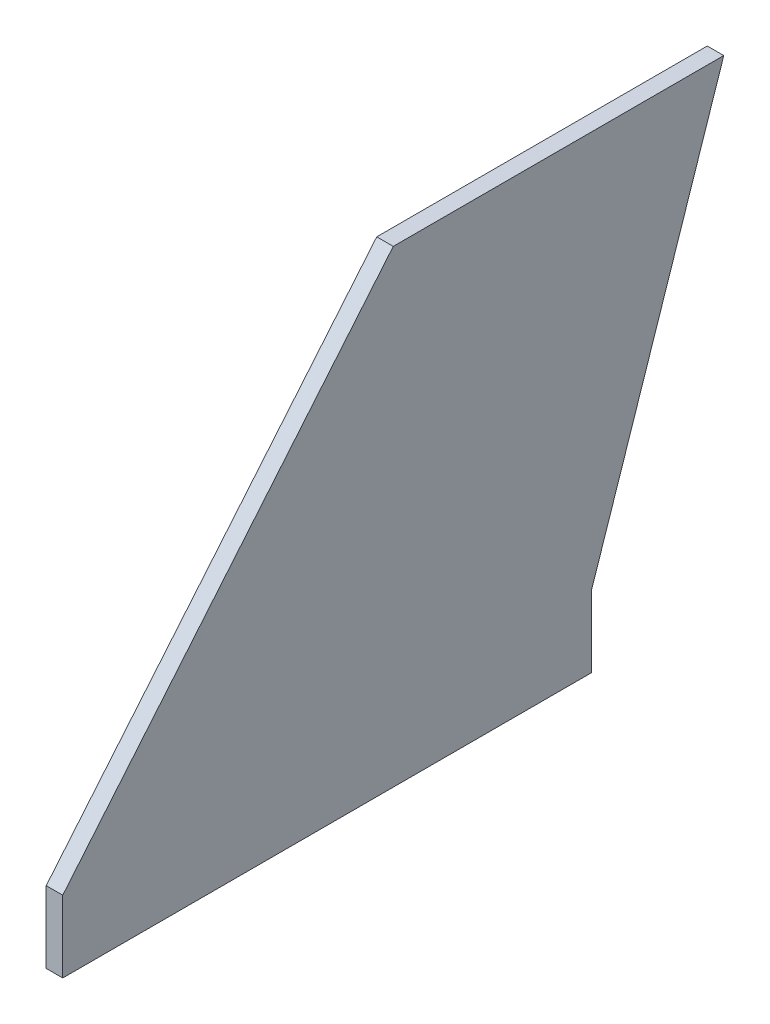
ISO-10303-21;
HEADER;
FILE_DESCRIPTION(('STEP AP214'),'2;1');
FILE_NAME('part.step','',(''),(''),'','','');
FILE_SCHEMA(('AUTOMOTIVE_DESIGN { 1 0 10303 214 1 1 1 1 }'));
ENDSEC;
DATA;
#1=APPLICATION_CONTEXT('core data for automotive mechanical design processes');
#2=APPLICATION_PROTOCOL_DEFINITION('international standard','automotive_design',2000,#1);
#3=PRODUCT_CONTEXT('',#1,'mechanical');
#4=PRODUCT('Part','Part','',(#3));
#5=PRODUCT_RELATED_PRODUCT_CATEGORY('part','',(#4));
#6=PRODUCT_DEFINITION_FORMATION('','',#4);
#7=PRODUCT_DEFINITION_CONTEXT('part definition',#1,'design');
#8=PRODUCT_DEFINITION('design','',#6,#7);
#9=PRODUCT_DEFINITION_SHAPE('','',#8);
#10=(LENGTH_UNIT() NAMED_UNIT(*) SI_UNIT(.MILLI.,.METRE.));
#11=(NAMED_UNIT(*) PLANE_ANGLE_UNIT() SI_UNIT($,.RADIAN.));
#12=(NAMED_UNIT(*) SI_UNIT($,.STERADIAN.) SOLID_ANGLE_UNIT());
#13=UNCERTAINTY_MEASURE_WITH_UNIT(LENGTH_MEASURE(1.E-05),#10,'distance_accuracy_value','');
#14=(GEOMETRIC_REPRESENTATION_CONTEXT(3) GLOBAL_UNCERTAINTY_ASSIGNED_CONTEXT((#13)) GLOBAL_UNIT_ASSIGNED_CONTEXT((#10,
#11,#12)) REPRESENTATION_CONTEXT('',''));
#15=CARTESIAN_POINT('',(0.,0.,0.));
#16=DIRECTION('',(0.,0.,1.));
#17=DIRECTION('',(1.,0.,0.));
#18=AXIS2_PLACEMENT_3D('',#15,#16,#17);
#19=CARTESIAN_POINT('',(6.35,0.,0.));
#20=DIRECTION('',(0.,-0.316227766016838,-0.948683298050514));
#21=DIRECTION('',(0.,0.948683298050514,-0.316227766016838));
#22=AXIS2_PLACEMENT_3D('',#19,#20,#21);
#23=PLANE('',#22);
#24=DIRECTION('',(0.,-0.948683298050514,0.316227766016838));
#25=VECTOR('',#24,1.);
#26=CARTESIAN_POINT('',(0.,0.,0.));
#27=LINE('',#26,#25);
#28=CARTESIAN_POINT('',(0.,152.4,-50.8));
#29=VERTEX_POINT('',#28);
#30=CARTESIAN_POINT('',(0.,0.,0.));
#31=VERTEX_POINT('',#30);
#32=EDGE_CURVE('E115',#29,#31,#27,.T.);
#33=ORIENTED_EDGE('',*,*,#32,.F.);
#34=DIRECTION('',(-1.,0.,0.));
#35=VECTOR('',#34,1.);
#36=CARTESIAN_POINT('',(6.35,152.4,-50.8));
#37=LINE('',#36,#35);
#38=CARTESIAN_POINT('',(6.35,152.4,-50.8));
#39=VERTEX_POINT('',#38);
#40=EDGE_CURVE('E11',#39,#29,#37,.T.);
#41=ORIENTED_EDGE('',*,*,#40,.F.);
#42=DIRECTION('',(0.,-0.948683298050514,0.316227766016838));
#43=VECTOR('',#42,1.);
#44=CARTESIAN_POINT('',(6.35,0.,0.));
#45=LINE('',#44,#43);
#46=CARTESIAN_POINT('',(6.35,0.,0.));
#47=VERTEX_POINT('',#46);
#48=EDGE_CURVE('E128',#39,#47,#45,.T.);
#49=ORIENTED_EDGE('',*,*,#48,.T.);
#50=DIRECTION('',(-1.,0.,0.));
#51=VECTOR('',#50,1.);
#52=CARTESIAN_POINT('',(6.35,0.,0.));
#53=LINE('',#52,#51);
#54=EDGE_CURVE('E80',#47,#31,#53,.T.);
#55=ORIENTED_EDGE('',*,*,#54,.T.);
#56=EDGE_LOOP('',(#33,#41,#49,#55));
#57=FACE_BOUND('',#56,.T.);
#58=ADVANCED_FACE('F35',(#57),#23,.T.);
#59=CARTESIAN_POINT('',(6.35,152.4,0.));
#60=DIRECTION('',(0.,1.,0.));
#61=DIRECTION('',(0.,0.,1.));
#62=AXIS2_PLACEMENT_3D('',#59,#60,#61);
#63=PLANE('',#62);
#64=DIRECTION('',(0.,0.,-1.));
#65=VECTOR('',#64,1.);
#66=CARTESIAN_POINT('',(0.,152.4,0.));
#67=LINE('',#66,#65);
#68=CARTESIAN_POINT('',(0.,152.4,76.2));
#69=VERTEX_POINT('',#68);
#70=EDGE_CURVE('E118',#69,#29,#67,.T.);
#71=ORIENTED_EDGE('',*,*,#70,.F.);
#72=DIRECTION('',(-1.,0.,0.));
#73=VECTOR('',#72,1.);
#74=CARTESIAN_POINT('',(6.35,152.4,76.2));
#75=LINE('',#74,#73);
#76=CARTESIAN_POINT('',(6.35,152.4,76.2));
#77=VERTEX_POINT('',#76);
#78=EDGE_CURVE('E43',#77,#69,#75,.T.);
#79=ORIENTED_EDGE('',*,*,#78,.F.);
#80=DIRECTION('',(0.,0.,-1.));
#81=VECTOR('',#80,1.);
#82=CARTESIAN_POINT('',(6.35,152.4,0.));
#83=LINE('',#82,#81);
#84=EDGE_CURVE('E143',#77,#39,#83,.T.);
#85=ORIENTED_EDGE('',*,*,#84,.T.);
#86=ORIENTED_EDGE('',*,*,#40,.T.);
#87=EDGE_LOOP('',(#71,#79,#85,#86));
#88=FACE_BOUND('',#87,.T.);
#89=ADVANCED_FACE('F137',(#88),#63,.T.);
#90=CARTESIAN_POINT('',(6.35,99.9344262295082,119.92131147541));
#91=DIRECTION('',(0.,0.64018439966448,0.768221279597376));
#92=DIRECTION('',(0.,-0.768221279597376,0.64018439966448));
#93=AXIS2_PLACEMENT_3D('',#90,#91,#92);
#94=PLANE('',#93);
#95=DIRECTION('',(0.,0.768221279597376,-0.64018439966448));
#96=VECTOR('',#95,1.);
#97=CARTESIAN_POINT('',(0.,99.9344262295082,119.92131147541));
#98=LINE('',#97,#96);
#99=CARTESIAN_POINT('',(0.,0.,203.2));
#100=VERTEX_POINT('',#99);
#101=EDGE_CURVE('E121',#100,#69,#98,.T.);
#102=ORIENTED_EDGE('',*,*,#101,.F.);
#103=DIRECTION('',(-1.,0.,0.));
#104=VECTOR('',#103,1.);
#105=CARTESIAN_POINT('',(6.35,0.,203.2));
#106=LINE('',#105,#104);
#107=CARTESIAN_POINT('',(6.35,0.,203.2));
#108=VERTEX_POINT('',#107);
#109=EDGE_CURVE('E107',#108,#100,#106,.T.);
#110=ORIENTED_EDGE('',*,*,#109,.F.);
#111=DIRECTION('',(0.,0.768221279597376,-0.64018439966448));
#112=VECTOR('',#111,1.);
#113=CARTESIAN_POINT('',(6.35,99.9344262295082,119.92131147541));
#114=LINE('',#113,#112);
#115=EDGE_CURVE('E100',#108,#77,#114,.T.);
#116=ORIENTED_EDGE('',*,*,#115,.T.);
#117=ORIENTED_EDGE('',*,*,#78,.T.);
#118=EDGE_LOOP('',(#102,#110,#116,#117));
#119=FACE_BOUND('',#118,.T.);
#120=ADVANCED_FACE('F134',(#119),#94,.T.);
#121=CARTESIAN_POINT('',(6.35,0.,203.2));
#122=DIRECTION('',(0.,0.,-1.));
#123=DIRECTION('',(-1.,0.,0.));
#124=AXIS2_PLACEMENT_3D('',#121,#122,#123);
#125=PLANE('',#124);
#126=DIRECTION('',(0.,-1.,0.));
#127=VECTOR('',#126,1.);
#128=CARTESIAN_POINT('',(0.,0.,203.2));
#129=LINE('',#128,#127);
#130=CARTESIAN_POINT('',(0.,-27.559,203.2));
#131=VERTEX_POINT('',#130);
#132=EDGE_CURVE('E106',#100,#131,#129,.T.);
#133=ORIENTED_EDGE('',*,*,#132,.T.);
#134=DIRECTION('',(-1.,0.,0.));
#135=VECTOR('',#134,1.);
#136=CARTESIAN_POINT('',(6.35,-27.559,203.2));
#137=LINE('',#136,#135);
#138=CARTESIAN_POINT('',(6.35,-27.559,203.2));
#139=VERTEX_POINT('',#138);
#140=EDGE_CURVE('E103',#139,#131,#137,.T.);
#141=ORIENTED_EDGE('',*,*,#140,.F.);
#142=DIRECTION('',(0.,-1.,0.));
#143=VECTOR('',#142,1.);
#144=CARTESIAN_POINT('',(6.35,0.,203.2));
#145=LINE('',#144,#143);
#146=EDGE_CURVE('E93',#108,#139,#145,.T.);
#147=ORIENTED_EDGE('',*,*,#146,.F.);
#148=ORIENTED_EDGE('',*,*,#109,.T.);
#149=EDGE_LOOP('',(#133,#141,#147,#148));
#150=FACE_BOUND('',#149,.T.);
#151=ADVANCED_FACE('F104',(#150),#125,.F.);
#152=CARTESIAN_POINT('',(6.35,-27.559,0.));
#153=DIRECTION('',(0.,1.,0.));
#154=DIRECTION('',(0.,0.,1.));
#155=AXIS2_PLACEMENT_3D('',#152,#153,#154);
#156=PLANE('',#155);
#157=DIRECTION('',(0.,0.,-1.));
#158=VECTOR('',#157,1.);
#159=CARTESIAN_POINT('',(0.,-27.559,0.));
#160=LINE('',#159,#158);
#161=CARTESIAN_POINT('',(0.,-27.559,0.));
#162=VERTEX_POINT('',#161);
#163=EDGE_CURVE('E73',#131,#162,#160,.T.);
#164=ORIENTED_EDGE('',*,*,#163,.T.);
#165=DIRECTION('',(-1.,0.,0.));
#166=VECTOR('',#165,1.);
#167=CARTESIAN_POINT('',(6.35,-27.559,0.));
#168=LINE('',#167,#166);
#169=CARTESIAN_POINT('',(6.35,-27.559,0.));
#170=VERTEX_POINT('',#169);
#171=EDGE_CURVE('E108',#170,#162,#168,.T.);
#172=ORIENTED_EDGE('',*,*,#171,.F.);
#173=DIRECTION('',(0.,0.,-1.));
#174=VECTOR('',#173,1.);
#175=CARTESIAN_POINT('',(6.35,-27.559,0.));
#176=LINE('',#175,#174);
#177=EDGE_CURVE('E97',#139,#170,#176,.T.);
#178=ORIENTED_EDGE('',*,*,#177,.F.);
#179=ORIENTED_EDGE('',*,*,#140,.T.);
#180=EDGE_LOOP('',(#164,#172,#178,#179));
#181=FACE_BOUND('',#180,.T.);
#182=ADVANCED_FACE('F110',(#181),#156,.F.);
#183=CARTESIAN_POINT('',(6.35,0.,0.));
#184=DIRECTION('',(0.,0.,1.));
#185=DIRECTION('',(1.,0.,0.));
#186=AXIS2_PLACEMENT_3D('',#183,#184,#185);
#187=PLANE('',#186);
#188=DIRECTION('',(0.,1.,0.));
#189=VECTOR('',#188,1.);
#190=CARTESIAN_POINT('',(0.,0.,0.));
#191=LINE('',#190,#189);
#192=EDGE_CURVE('E126',#162,#31,#191,.T.);
#193=ORIENTED_EDGE('',*,*,#192,.T.);
#194=ORIENTED_EDGE('',*,*,#54,.F.);
#195=DIRECTION('',(0.,1.,0.));
#196=VECTOR('',#195,1.);
#197=CARTESIAN_POINT('',(6.35,0.,0.));
#198=LINE('',#197,#196);
#199=EDGE_CURVE('E51',#170,#47,#198,.T.);
#200=ORIENTED_EDGE('',*,*,#199,.F.);
#201=ORIENTED_EDGE('',*,*,#171,.T.);
#202=EDGE_LOOP('',(#193,#194,#200,#201));
#203=FACE_BOUND('',#202,.T.);
#204=ADVANCED_FACE('F142',(#203),#187,.F.);
#205=CARTESIAN_POINT('',(6.35,0.,0.));
#206=DIRECTION('',(1.,0.,0.));
#207=DIRECTION('',(0.,0.,-1.));
#208=AXIS2_PLACEMENT_3D('',#205,#206,#207);
#209=PLANE('',#208);
#210=ORIENTED_EDGE('',*,*,#48,.F.);
#211=ORIENTED_EDGE('',*,*,#84,.F.);
#212=ORIENTED_EDGE('',*,*,#115,.F.);
#213=ORIENTED_EDGE('',*,*,#146,.T.);
#214=ORIENTED_EDGE('',*,*,#177,.T.);
#215=ORIENTED_EDGE('',*,*,#199,.T.);
#216=EDGE_LOOP('',(#210,#211,#212,#213,#214,#215));
#217=FACE_BOUND('',#216,.T.);
#218=ADVANCED_FACE('F95',(#217),#209,.T.);
#219=CARTESIAN_POINT('',(0.,0.,0.));
#220=DIRECTION('',(1.,0.,0.));
#221=DIRECTION('',(0.,0.,-1.));
#222=AXIS2_PLACEMENT_3D('',#219,#220,#221);
#223=PLANE('',#222);
#224=ORIENTED_EDGE('',*,*,#32,.T.);
#225=ORIENTED_EDGE('',*,*,#192,.F.);
#226=ORIENTED_EDGE('',*,*,#163,.F.);
#227=ORIENTED_EDGE('',*,*,#132,.F.);
#228=ORIENTED_EDGE('',*,*,#101,.T.);
#229=ORIENTED_EDGE('',*,*,#70,.T.);
#230=EDGE_LOOP('',(#224,#225,#226,#227,#228,#229));
#231=FACE_BOUND('',#230,.T.);
#232=ADVANCED_FACE('F139',(#231),#223,.F.);
#233=CLOSED_SHELL('',(#58,#89,#120,#151,#182,#204,#218,#232));
#234=MANIFOLD_SOLID_BREP('B2',#233);
#235=ADVANCED_BREP_SHAPE_REPRESENTATION('',(#18,#234),#14);
#236=SHAPE_DEFINITION_REPRESENTATION(#9,#235);
ENDSEC;
END-ISO-10303-21;
